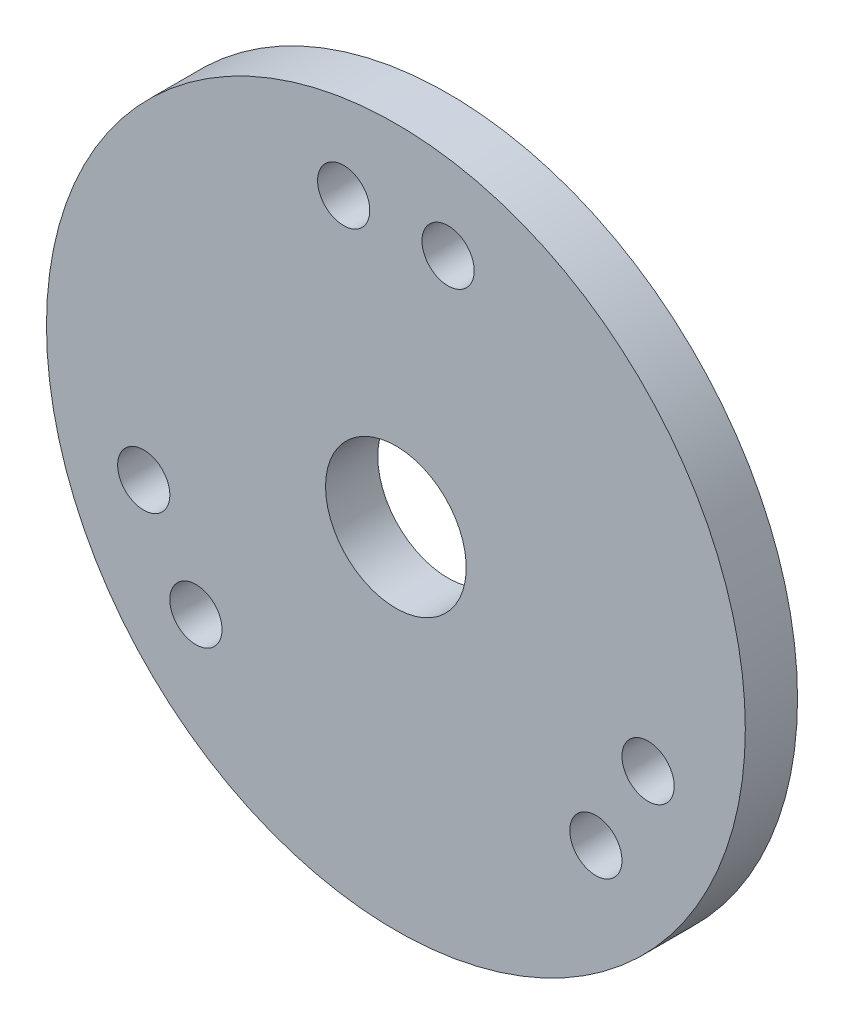
ISO-10303-21;
HEADER;
FILE_DESCRIPTION(('STEP AP214'),'2;1');
FILE_NAME('part.step','',(''),(''),'','','');
FILE_SCHEMA(('AUTOMOTIVE_DESIGN { 1 0 10303 214 1 1 1 1 }'));
ENDSEC;
DATA;
#1=APPLICATION_CONTEXT('core data for automotive mechanical design processes');
#2=APPLICATION_PROTOCOL_DEFINITION('international standard','automotive_design',2000,#1);
#3=PRODUCT_CONTEXT('',#1,'mechanical');
#4=PRODUCT('Part','Part','',(#3));
#5=PRODUCT_RELATED_PRODUCT_CATEGORY('part','',(#4));
#6=PRODUCT_DEFINITION_FORMATION('','',#4);
#7=PRODUCT_DEFINITION_CONTEXT('part definition',#1,'design');
#8=PRODUCT_DEFINITION('design','',#6,#7);
#9=PRODUCT_DEFINITION_SHAPE('','',#8);
#10=(LENGTH_UNIT() NAMED_UNIT(*) SI_UNIT(.MILLI.,.METRE.));
#11=(NAMED_UNIT(*) PLANE_ANGLE_UNIT() SI_UNIT($,.RADIAN.));
#12=(NAMED_UNIT(*) SI_UNIT($,.STERADIAN.) SOLID_ANGLE_UNIT());
#13=UNCERTAINTY_MEASURE_WITH_UNIT(LENGTH_MEASURE(1.E-05),#10,'distance_accuracy_value','');
#14=(GEOMETRIC_REPRESENTATION_CONTEXT(3) GLOBAL_UNCERTAINTY_ASSIGNED_CONTEXT((#13)) GLOBAL_UNIT_ASSIGNED_CONTEXT((#10,
#11,#12)) REPRESENTATION_CONTEXT('',''));
#15=CARTESIAN_POINT('',(0.,0.,0.));
#16=DIRECTION('',(0.,0.,1.));
#17=DIRECTION('',(1.,0.,0.));
#18=AXIS2_PLACEMENT_3D('',#15,#16,#17);
#19=CARTESIAN_POINT('',(0.,0.,-15.39));
#20=DIRECTION('',(0.,0.,-1.));
#21=DIRECTION('',(-1.,0.,0.));
#22=AXIS2_PLACEMENT_3D('',#19,#20,#21);
#23=PLANE('',#22);
#24=CARTESIAN_POINT('',(-6.35,31.75,-15.39));
#25=DIRECTION('',(0.,0.,-1.));
#26=DIRECTION('',(-1.,0.,0.));
#27=AXIS2_PLACEMENT_3D('',#24,#25,#26);
#28=CIRCLE('',#27,3.175);
#29=CARTESIAN_POINT('',(-9.525,31.75,-15.39));
#30=VERTEX_POINT('',#29);
#31=EDGE_CURVE('E75',#30,#30,#28,.T.);
#32=ORIENTED_EDGE('',*,*,#31,.F.);
#33=EDGE_LOOP('',(#32));
#34=FACE_BOUND('',#33,.T.);
#35=CARTESIAN_POINT('',(-24.3213065701589,-21.3742613140286,-15.39));
#36=DIRECTION('',(0.,0.,-1.));
#37=DIRECTION('',(-1.,0.,0.));
#38=AXIS2_PLACEMENT_3D('',#35,#36,#37);
#39=CIRCLE('',#38,3.17500000000336);
#40=CARTESIAN_POINT('',(-27.4963065701623,-21.3742613140286,-15.39));
#41=VERTEX_POINT('',#40);
#42=EDGE_CURVE('E63',#41,#41,#39,.T.);
#43=ORIENTED_EDGE('',*,*,#42,.F.);
#44=EDGE_LOOP('',(#43));
#45=FACE_BOUND('',#44,.T.);
#46=CARTESIAN_POINT('',(30.6713065701522,-10.3757386859701,-15.39));
#47=DIRECTION('',(0.,0.,-1.));
#48=DIRECTION('',(-1.,0.,0.));
#49=AXIS2_PLACEMENT_3D('',#46,#47,#48);
#50=CIRCLE('',#49,3.17500000000388);
#51=CARTESIAN_POINT('',(27.4963065701483,-10.3757386859701,-15.39));
#52=VERTEX_POINT('',#51);
#53=EDGE_CURVE('E51',#52,#52,#50,.T.);
#54=ORIENTED_EDGE('',*,*,#53,.F.);
#55=EDGE_LOOP('',(#54));
#56=FACE_BOUND('',#55,.T.);
#57=CARTESIAN_POINT('',(0.,0.,-15.39));
#58=DIRECTION('',(0.,0.,-1.));
#59=DIRECTION('',(-1.,0.,0.));
#60=AXIS2_PLACEMENT_3D('',#57,#58,#59);
#61=CIRCLE('',#60,42.5);
#62=CARTESIAN_POINT('',(-42.5,0.,-15.39));
#63=VERTEX_POINT('',#62);
#64=EDGE_CURVE('E10',#63,#63,#61,.T.);
#65=ORIENTED_EDGE('',*,*,#64,.T.);
#66=EDGE_LOOP('',(#65));
#67=FACE_BOUND('',#66,.T.);
#68=CARTESIAN_POINT('',(0.,0.,-15.39));
#69=DIRECTION('',(0.,0.,-1.));
#70=DIRECTION('',(-1.,0.,0.));
#71=AXIS2_PLACEMENT_3D('',#68,#69,#70);
#72=CIRCLE('',#71,8.55631617975598);
#73=CARTESIAN_POINT('',(-8.55631617975598,0.,-15.39));
#74=VERTEX_POINT('',#73);
#75=EDGE_CURVE('E46',#74,#74,#72,.T.);
#76=ORIENTED_EDGE('',*,*,#75,.F.);
#77=EDGE_LOOP('',(#76));
#78=FACE_BOUND('',#77,.T.);
#79=CARTESIAN_POINT('',(24.3213065701522,-21.3742613140325,-15.39));
#80=DIRECTION('',(0.,0.,-1.));
#81=DIRECTION('',(-1.,0.,0.));
#82=AXIS2_PLACEMENT_3D('',#79,#80,#81);
#83=CIRCLE('',#82,3.17500000000392);
#84=CARTESIAN_POINT('',(21.1463065701482,-21.3742613140325,-15.39));
#85=VERTEX_POINT('',#84);
#86=EDGE_CURVE('E57',#85,#85,#83,.T.);
#87=ORIENTED_EDGE('',*,*,#86,.F.);
#88=EDGE_LOOP('',(#87));
#89=FACE_BOUND('',#88,.T.);
#90=CARTESIAN_POINT('',(-30.6713065701589,-10.3757386859662,-15.39));
#91=DIRECTION('',(0.,0.,-1.));
#92=DIRECTION('',(-1.,0.,0.));
#93=AXIS2_PLACEMENT_3D('',#90,#91,#92);
#94=CIRCLE('',#93,3.17500000000338);
#95=CARTESIAN_POINT('',(-33.8463065701623,-10.3757386859662,-15.39));
#96=VERTEX_POINT('',#95);
#97=EDGE_CURVE('E69',#96,#96,#94,.T.);
#98=ORIENTED_EDGE('',*,*,#97,.F.);
#99=EDGE_LOOP('',(#98));
#100=FACE_BOUND('',#99,.T.);
#101=CARTESIAN_POINT('',(6.35,31.75,-15.39));
#102=DIRECTION('',(0.,0.,-1.));
#103=DIRECTION('',(-1.,0.,0.));
#104=AXIS2_PLACEMENT_3D('',#101,#102,#103);
#105=CIRCLE('',#104,3.175);
#106=CARTESIAN_POINT('',(3.175,31.75,-15.39));
#107=VERTEX_POINT('',#106);
#108=EDGE_CURVE('E81',#107,#107,#105,.T.);
#109=ORIENTED_EDGE('',*,*,#108,.F.);
#110=EDGE_LOOP('',(#109));
#111=FACE_BOUND('',#110,.T.);
#112=ADVANCED_FACE('F35',(#34,#45,#56,#67,#78,#89,#100,#111),#23,.T.);
#113=CARTESIAN_POINT('',(0.,0.,-9.04));
#114=DIRECTION('',(0.,0.,-1.));
#115=DIRECTION('',(-1.,0.,0.));
#116=AXIS2_PLACEMENT_3D('',#113,#114,#115);
#117=PLANE('',#116);
#118=CARTESIAN_POINT('',(0.,0.,-9.04));
#119=DIRECTION('',(0.,0.,-1.));
#120=DIRECTION('',(-1.,0.,0.));
#121=AXIS2_PLACEMENT_3D('',#118,#119,#120);
#122=CIRCLE('',#121,42.5);
#123=CARTESIAN_POINT('',(-42.5,0.,-9.04));
#124=VERTEX_POINT('',#123);
#125=EDGE_CURVE('E39',#124,#124,#122,.T.);
#126=ORIENTED_EDGE('',*,*,#125,.F.);
#127=EDGE_LOOP('',(#126));
#128=FACE_BOUND('',#127,.T.);
#129=CARTESIAN_POINT('',(0.,0.,-9.04));
#130=DIRECTION('',(0.,0.,-1.));
#131=DIRECTION('',(-1.,0.,0.));
#132=AXIS2_PLACEMENT_3D('',#129,#130,#131);
#133=CIRCLE('',#132,8.55631617975598);
#134=CARTESIAN_POINT('',(-8.55631617975598,0.,-9.04));
#135=VERTEX_POINT('',#134);
#136=EDGE_CURVE('E48',#135,#135,#133,.T.);
#137=ORIENTED_EDGE('',*,*,#136,.T.);
#138=EDGE_LOOP('',(#137));
#139=FACE_BOUND('',#138,.T.);
#140=CARTESIAN_POINT('',(30.6713065701522,-10.3757386859701,-9.04));
#141=DIRECTION('',(0.,0.,-1.));
#142=DIRECTION('',(-1.,0.,0.));
#143=AXIS2_PLACEMENT_3D('',#140,#141,#142);
#144=CIRCLE('',#143,3.17500000000388);
#145=CARTESIAN_POINT('',(27.4963065701483,-10.3757386859701,-9.04));
#146=VERTEX_POINT('',#145);
#147=EDGE_CURVE('E54',#146,#146,#144,.T.);
#148=ORIENTED_EDGE('',*,*,#147,.T.);
#149=EDGE_LOOP('',(#148));
#150=FACE_BOUND('',#149,.T.);
#151=CARTESIAN_POINT('',(24.3213065701522,-21.3742613140325,-9.04));
#152=DIRECTION('',(0.,0.,-1.));
#153=DIRECTION('',(-1.,0.,0.));
#154=AXIS2_PLACEMENT_3D('',#151,#152,#153);
#155=CIRCLE('',#154,3.17500000000392);
#156=CARTESIAN_POINT('',(21.1463065701482,-21.3742613140325,-9.04));
#157=VERTEX_POINT('',#156);
#158=EDGE_CURVE('E60',#157,#157,#155,.T.);
#159=ORIENTED_EDGE('',*,*,#158,.T.);
#160=EDGE_LOOP('',(#159));
#161=FACE_BOUND('',#160,.T.);
#162=CARTESIAN_POINT('',(-24.3213065701589,-21.3742613140286,-9.04));
#163=DIRECTION('',(0.,0.,-1.));
#164=DIRECTION('',(-1.,0.,0.));
#165=AXIS2_PLACEMENT_3D('',#162,#163,#164);
#166=CIRCLE('',#165,3.17500000000336);
#167=CARTESIAN_POINT('',(-27.4963065701623,-21.3742613140286,-9.04));
#168=VERTEX_POINT('',#167);
#169=EDGE_CURVE('E66',#168,#168,#166,.T.);
#170=ORIENTED_EDGE('',*,*,#169,.T.);
#171=EDGE_LOOP('',(#170));
#172=FACE_BOUND('',#171,.T.);
#173=CARTESIAN_POINT('',(-30.6713065701589,-10.3757386859662,-9.04));
#174=DIRECTION('',(0.,0.,-1.));
#175=DIRECTION('',(-1.,0.,0.));
#176=AXIS2_PLACEMENT_3D('',#173,#174,#175);
#177=CIRCLE('',#176,3.17500000000338);
#178=CARTESIAN_POINT('',(-33.8463065701623,-10.3757386859662,-9.04));
#179=VERTEX_POINT('',#178);
#180=EDGE_CURVE('E72',#179,#179,#177,.T.);
#181=ORIENTED_EDGE('',*,*,#180,.T.);
#182=EDGE_LOOP('',(#181));
#183=FACE_BOUND('',#182,.T.);
#184=CARTESIAN_POINT('',(-6.35,31.75,-9.04));
#185=DIRECTION('',(0.,0.,-1.));
#186=DIRECTION('',(-1.,0.,0.));
#187=AXIS2_PLACEMENT_3D('',#184,#185,#186);
#188=CIRCLE('',#187,3.175);
#189=CARTESIAN_POINT('',(-9.525,31.75,-9.04));
#190=VERTEX_POINT('',#189);
#191=EDGE_CURVE('E78',#190,#190,#188,.T.);
#192=ORIENTED_EDGE('',*,*,#191,.T.);
#193=EDGE_LOOP('',(#192));
#194=FACE_BOUND('',#193,.T.);
#195=CARTESIAN_POINT('',(6.35,31.75,-9.04));
#196=DIRECTION('',(0.,0.,-1.));
#197=DIRECTION('',(-1.,0.,0.));
#198=AXIS2_PLACEMENT_3D('',#195,#196,#197);
#199=CIRCLE('',#198,3.175);
#200=CARTESIAN_POINT('',(3.175,31.75,-9.04));
#201=VERTEX_POINT('',#200);
#202=EDGE_CURVE('E84',#201,#201,#199,.T.);
#203=ORIENTED_EDGE('',*,*,#202,.T.);
#204=EDGE_LOOP('',(#203));
#205=FACE_BOUND('',#204,.T.);
#206=ADVANCED_FACE('F94',(#128,#139,#150,#161,#172,#183,#194,#205),#117,.F.);
#207=CARTESIAN_POINT('',(0.,0.,-15.39));
#208=DIRECTION('',(0.,0.,1.));
#209=DIRECTION('',(1.,0.,0.));
#210=AXIS2_PLACEMENT_3D('',#207,#208,#209);
#211=CYLINDRICAL_SURFACE('',#210,42.5);
#212=ORIENTED_EDGE('',*,*,#64,.F.);
#213=EDGE_LOOP('',(#212));
#214=FACE_BOUND('',#213,.T.);
#215=ORIENTED_EDGE('',*,*,#125,.T.);
#216=EDGE_LOOP('',(#215));
#217=FACE_BOUND('',#216,.T.);
#218=ADVANCED_FACE('F37',(#214,#217),#211,.T.);
#219=CARTESIAN_POINT('',(0.,0.,-15.39));
#220=DIRECTION('',(0.,0.,1.));
#221=DIRECTION('',(1.,0.,0.));
#222=AXIS2_PLACEMENT_3D('',#219,#220,#221);
#223=CYLINDRICAL_SURFACE('',#222,8.55631617975598);
#224=ORIENTED_EDGE('',*,*,#75,.T.);
#225=EDGE_LOOP('',(#224));
#226=FACE_BOUND('',#225,.T.);
#227=ORIENTED_EDGE('',*,*,#136,.F.);
#228=EDGE_LOOP('',(#227));
#229=FACE_BOUND('',#228,.T.);
#230=ADVANCED_FACE('F104',(#226,#229),#223,.F.);
#231=CARTESIAN_POINT('',(30.6713065701522,-10.3757386859701,-15.39));
#232=DIRECTION('',(0.,0.,1.));
#233=DIRECTION('',(1.,0.,0.));
#234=AXIS2_PLACEMENT_3D('',#231,#232,#233);
#235=CYLINDRICAL_SURFACE('',#234,3.17500000000388);
#236=ORIENTED_EDGE('',*,*,#53,.T.);
#237=EDGE_LOOP('',(#236));
#238=FACE_BOUND('',#237,.T.);
#239=ORIENTED_EDGE('',*,*,#147,.F.);
#240=EDGE_LOOP('',(#239));
#241=FACE_BOUND('',#240,.T.);
#242=ADVANCED_FACE('F107',(#238,#241),#235,.F.);
#243=CARTESIAN_POINT('',(24.3213065701522,-21.3742613140325,-15.39));
#244=DIRECTION('',(0.,0.,1.));
#245=DIRECTION('',(1.,0.,0.));
#246=AXIS2_PLACEMENT_3D('',#243,#244,#245);
#247=CYLINDRICAL_SURFACE('',#246,3.17500000000392);
#248=ORIENTED_EDGE('',*,*,#86,.T.);
#249=EDGE_LOOP('',(#248));
#250=FACE_BOUND('',#249,.T.);
#251=ORIENTED_EDGE('',*,*,#158,.F.);
#252=EDGE_LOOP('',(#251));
#253=FACE_BOUND('',#252,.T.);
#254=ADVANCED_FACE('F111',(#250,#253),#247,.F.);
#255=CARTESIAN_POINT('',(-24.3213065701589,-21.3742613140286,-15.39));
#256=DIRECTION('',(0.,0.,1.));
#257=DIRECTION('',(1.,0.,0.));
#258=AXIS2_PLACEMENT_3D('',#255,#256,#257);
#259=CYLINDRICAL_SURFACE('',#258,3.17500000000336);
#260=ORIENTED_EDGE('',*,*,#42,.T.);
#261=EDGE_LOOP('',(#260));
#262=FACE_BOUND('',#261,.T.);
#263=ORIENTED_EDGE('',*,*,#169,.F.);
#264=EDGE_LOOP('',(#263));
#265=FACE_BOUND('',#264,.T.);
#266=ADVANCED_FACE('F115',(#262,#265),#259,.F.);
#267=CARTESIAN_POINT('',(-30.6713065701589,-10.3757386859662,-15.39));
#268=DIRECTION('',(0.,0.,1.));
#269=DIRECTION('',(1.,0.,0.));
#270=AXIS2_PLACEMENT_3D('',#267,#268,#269);
#271=CYLINDRICAL_SURFACE('',#270,3.17500000000338);
#272=ORIENTED_EDGE('',*,*,#97,.T.);
#273=EDGE_LOOP('',(#272));
#274=FACE_BOUND('',#273,.T.);
#275=ORIENTED_EDGE('',*,*,#180,.F.);
#276=EDGE_LOOP('',(#275));
#277=FACE_BOUND('',#276,.T.);
#278=ADVANCED_FACE('F119',(#274,#277),#271,.F.);
#279=CARTESIAN_POINT('',(-6.35,31.75,-15.39));
#280=DIRECTION('',(0.,0.,1.));
#281=DIRECTION('',(1.,0.,0.));
#282=AXIS2_PLACEMENT_3D('',#279,#280,#281);
#283=CYLINDRICAL_SURFACE('',#282,3.175);
#284=ORIENTED_EDGE('',*,*,#31,.T.);
#285=EDGE_LOOP('',(#284));
#286=FACE_BOUND('',#285,.T.);
#287=ORIENTED_EDGE('',*,*,#191,.F.);
#288=EDGE_LOOP('',(#287));
#289=FACE_BOUND('',#288,.T.);
#290=ADVANCED_FACE('F123',(#286,#289),#283,.F.);
#291=CARTESIAN_POINT('',(6.35,31.75,-15.39));
#292=DIRECTION('',(0.,0.,1.));
#293=DIRECTION('',(1.,0.,0.));
#294=AXIS2_PLACEMENT_3D('',#291,#292,#293);
#295=CYLINDRICAL_SURFACE('',#294,3.175);
#296=ORIENTED_EDGE('',*,*,#108,.T.);
#297=EDGE_LOOP('',(#296));
#298=FACE_BOUND('',#297,.T.);
#299=ORIENTED_EDGE('',*,*,#202,.F.);
#300=EDGE_LOOP('',(#299));
#301=FACE_BOUND('',#300,.T.);
#302=ADVANCED_FACE('F90',(#298,#301),#295,.F.);
#303=CLOSED_SHELL('',(#112,#206,#218,#230,#242,#254,#266,#278,#290,#302));
#304=MANIFOLD_SOLID_BREP('B2',#303);
#305=ADVANCED_BREP_SHAPE_REPRESENTATION('',(#18,#304),#14);
#306=SHAPE_DEFINITION_REPRESENTATION(#9,#305);
ENDSEC;
END-ISO-10303-21;
